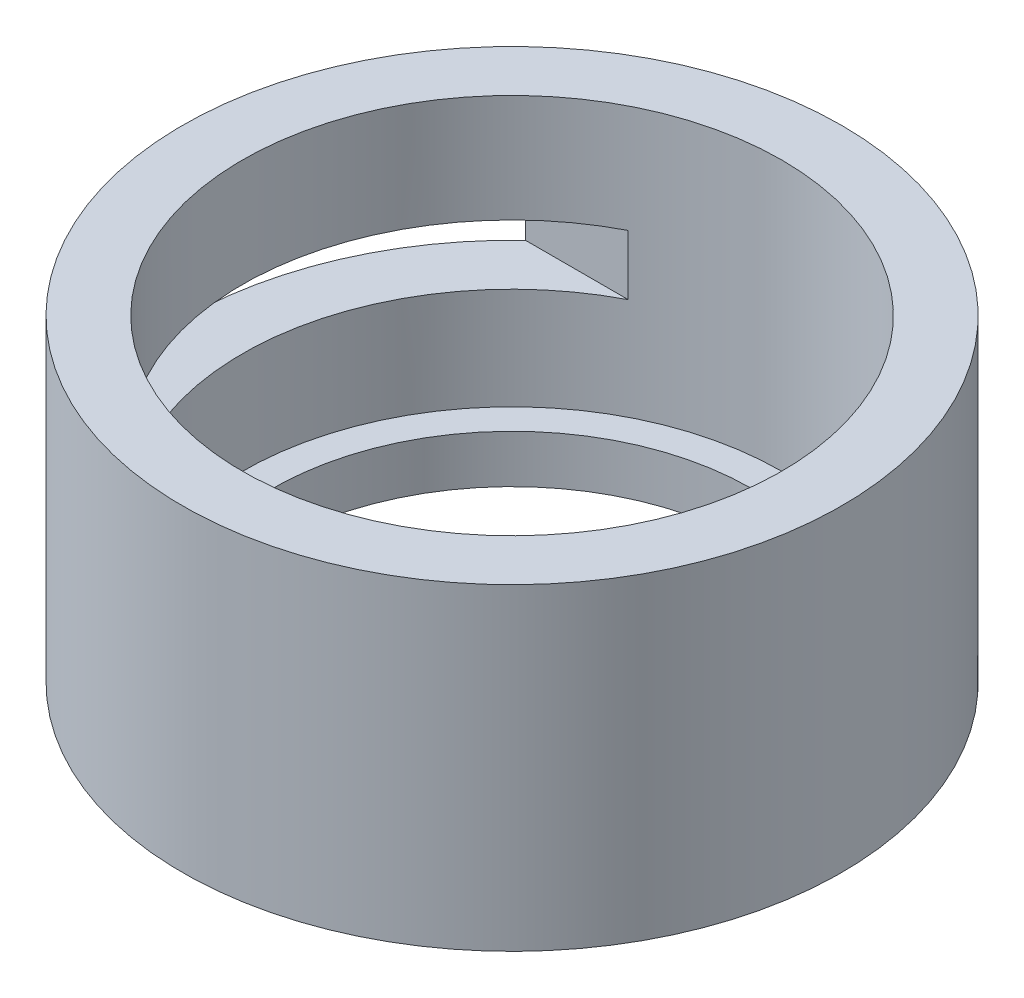
ISO-10303-21;
HEADER;
FILE_DESCRIPTION(('STEP AP214'),'2;1');
FILE_NAME('part.step','',(''),(''),'','','');
FILE_SCHEMA(('AUTOMOTIVE_DESIGN { 1 0 10303 214 1 1 1 1 }'));
ENDSEC;
DATA;
#1=APPLICATION_CONTEXT('core data for automotive mechanical design processes');
#2=APPLICATION_PROTOCOL_DEFINITION('international standard','automotive_design',2000,#1);
#3=PRODUCT_CONTEXT('',#1,'mechanical');
#4=PRODUCT('Part','Part','',(#3));
#5=PRODUCT_RELATED_PRODUCT_CATEGORY('part','',(#4));
#6=PRODUCT_DEFINITION_FORMATION('','',#4);
#7=PRODUCT_DEFINITION_CONTEXT('part definition',#1,'design');
#8=PRODUCT_DEFINITION('design','',#6,#7);
#9=PRODUCT_DEFINITION_SHAPE('','',#8);
#10=(LENGTH_UNIT() NAMED_UNIT(*) SI_UNIT(.MILLI.,.METRE.));
#11=(NAMED_UNIT(*) PLANE_ANGLE_UNIT() SI_UNIT($,.RADIAN.));
#12=(NAMED_UNIT(*) SI_UNIT($,.STERADIAN.) SOLID_ANGLE_UNIT());
#13=UNCERTAINTY_MEASURE_WITH_UNIT(LENGTH_MEASURE(1.E-05),#10,'distance_accuracy_value','');
#14=(GEOMETRIC_REPRESENTATION_CONTEXT(3) GLOBAL_UNCERTAINTY_ASSIGNED_CONTEXT((#13)) GLOBAL_UNIT_ASSIGNED_CONTEXT((#10,
#11,#12)) REPRESENTATION_CONTEXT('',''));
#15=CARTESIAN_POINT('',(0.,0.,0.));
#16=DIRECTION('',(0.,0.,1.));
#17=DIRECTION('',(1.,0.,0.));
#18=AXIS2_PLACEMENT_3D('',#15,#16,#17);
#19=CARTESIAN_POINT('',(0.,0.,0.));
#20=DIRECTION('',(0.,-1.,0.));
#21=DIRECTION('',(0.,0.,-1.));
#22=AXIS2_PLACEMENT_3D('',#19,#20,#21);
#23=CYLINDRICAL_SURFACE('',#22,40.);
#24=CARTESIAN_POINT('',(0.,7.91521559908043,0.));
#25=DIRECTION('',(0.,-1.,0.));
#26=DIRECTION('',(0.,0.,-1.));
#27=AXIS2_PLACEMENT_3D('',#24,#25,#26);
#28=CIRCLE('',#27,40.);
#29=CARTESIAN_POINT('',(0.,7.91521559908043,-40.));
#30=VERTEX_POINT('',#29);
#31=EDGE_CURVE('E82',#30,#30,#28,.T.);
#32=ORIENTED_EDGE('',*,*,#31,.T.);
#33=EDGE_LOOP('',(#32));
#34=FACE_BOUND('',#33,.T.);
#35=CARTESIAN_POINT('',(0.,15.9152155990804,0.));
#36=DIRECTION('',(0.,-1.,0.));
#37=DIRECTION('',(0.,0.,-1.));
#38=AXIS2_PLACEMENT_3D('',#35,#36,#37);
#39=CIRCLE('',#38,40.);
#40=CARTESIAN_POINT('',(0.,15.9152155990804,-40.));
#41=VERTEX_POINT('',#40);
#42=EDGE_CURVE('E109',#41,#41,#39,.T.);
#43=ORIENTED_EDGE('',*,*,#42,.F.);
#44=EDGE_LOOP('',(#43));
#45=FACE_BOUND('',#44,.T.);
#46=ADVANCED_FACE('F33',(#34,#45),#23,.F.);
#47=CARTESIAN_POINT('',(40.,7.91521559908043,0.));
#48=DIRECTION('',(0.,-1.,0.));
#49=DIRECTION('',(0.,0.,-1.));
#50=AXIS2_PLACEMENT_3D('',#47,#48,#49);
#51=PLANE('',#50);
#52=CARTESIAN_POINT('',(0.,7.91521559908043,0.));
#53=DIRECTION('',(0.,-1.,0.));
#54=DIRECTION('',(0.,0.,-1.));
#55=AXIS2_PLACEMENT_3D('',#52,#53,#54);
#56=CIRCLE('',#55,55.);
#57=CARTESIAN_POINT('',(0.,7.91521559908043,-55.));
#58=VERTEX_POINT('',#57);
#59=EDGE_CURVE('E97',#58,#58,#56,.T.);
#60=ORIENTED_EDGE('',*,*,#59,.T.);
#61=EDGE_LOOP('',(#60));
#62=FACE_BOUND('',#61,.T.);
#63=ORIENTED_EDGE('',*,*,#31,.F.);
#64=EDGE_LOOP('',(#63));
#65=FACE_BOUND('',#64,.T.);
#66=ADVANCED_FACE('F139',(#62,#65),#51,.T.);
#67=CARTESIAN_POINT('',(0.,0.,0.));
#68=DIRECTION('',(0.,-1.,0.));
#69=DIRECTION('',(0.,0.,-1.));
#70=AXIS2_PLACEMENT_3D('',#67,#68,#69);
#71=CYLINDRICAL_SURFACE('',#70,55.);
#72=CARTESIAN_POINT('',(0.,32.9152155990804,0.));
#73=DIRECTION('',(0.,-1.,0.));
#74=DIRECTION('',(0.,0.,-1.));
#75=AXIS2_PLACEMENT_3D('',#72,#73,#74);
#76=CIRCLE('',#75,55.);
#77=CARTESIAN_POINT('',(-37.7491721763537,32.9152155990804,-40.));
#78=VERTEX_POINT('',#77);
#79=CARTESIAN_POINT('',(-37.7491721763537,32.9152155990804,40.));
#80=VERTEX_POINT('',#79);
#81=EDGE_CURVE('E116',#78,#80,#76,.F.);
#82=ORIENTED_EDGE('',*,*,#81,.F.);
#83=DIRECTION('',(0.,-1.,0.));
#84=VECTOR('',#83,1.);
#85=CARTESIAN_POINT('',(-37.7491721763537,0.,-40.));
#86=LINE('',#85,#84);
#87=CARTESIAN_POINT('',(-37.7491721763537,42.9152155990804,-40.));
#88=VERTEX_POINT('',#87);
#89=EDGE_CURVE('E87',#88,#78,#86,.T.);
#90=ORIENTED_EDGE('',*,*,#89,.F.);
#91=CARTESIAN_POINT('',(0.,42.9152155990804,0.));
#92=DIRECTION('',(0.,1.,0.));
#93=DIRECTION('',(0.,0.,1.));
#94=AXIS2_PLACEMENT_3D('',#91,#92,#93);
#95=CIRCLE('',#94,55.);
#96=CARTESIAN_POINT('',(-37.7491721763537,42.9152155990804,40.));
#97=VERTEX_POINT('',#96);
#98=EDGE_CURVE('E55',#97,#88,#95,.F.);
#99=ORIENTED_EDGE('',*,*,#98,.F.);
#100=DIRECTION('',(0.,-1.,0.));
#101=VECTOR('',#100,1.);
#102=CARTESIAN_POINT('',(-37.7491721763537,0.,40.));
#103=LINE('',#102,#101);
#104=EDGE_CURVE('E114',#80,#97,#103,.F.);
#105=ORIENTED_EDGE('',*,*,#104,.F.);
#106=EDGE_LOOP('',(#82,#90,#99,#105));
#107=FACE_BOUND('',#106,.T.);
#108=CARTESIAN_POINT('',(0.,60.9152155990804,0.));
#109=DIRECTION('',(0.,-1.,0.));
#110=DIRECTION('',(0.,0.,-1.));
#111=AXIS2_PLACEMENT_3D('',#108,#109,#110);
#112=CIRCLE('',#111,55.);
#113=CARTESIAN_POINT('',(0.,60.9152155990804,-55.));
#114=VERTEX_POINT('',#113);
#115=EDGE_CURVE('E100',#114,#114,#112,.T.);
#116=ORIENTED_EDGE('',*,*,#115,.T.);
#117=EDGE_LOOP('',(#116));
#118=FACE_BOUND('',#117,.T.);
#119=ORIENTED_EDGE('',*,*,#59,.F.);
#120=EDGE_LOOP('',(#119));
#121=FACE_BOUND('',#120,.T.);
#122=ADVANCED_FACE('F123',(#107,#118,#121),#71,.T.);
#123=CARTESIAN_POINT('',(55.,60.9152155990804,0.));
#124=DIRECTION('',(0.,1.,0.));
#125=DIRECTION('',(0.,0.,1.));
#126=AXIS2_PLACEMENT_3D('',#123,#124,#125);
#127=PLANE('',#126);
#128=CARTESIAN_POINT('',(0.,60.9152155990804,0.));
#129=DIRECTION('',(0.,-1.,0.));
#130=DIRECTION('',(0.,0.,-1.));
#131=AXIS2_PLACEMENT_3D('',#128,#129,#130);
#132=CIRCLE('',#131,45.);
#133=CARTESIAN_POINT('',(0.,60.9152155990804,-45.));
#134=VERTEX_POINT('',#133);
#135=EDGE_CURVE('E103',#134,#134,#132,.T.);
#136=ORIENTED_EDGE('',*,*,#135,.T.);
#137=EDGE_LOOP('',(#136));
#138=FACE_BOUND('',#137,.T.);
#139=ORIENTED_EDGE('',*,*,#115,.F.);
#140=EDGE_LOOP('',(#139));
#141=FACE_BOUND('',#140,.T.);
#142=ADVANCED_FACE('F155',(#138,#141),#127,.T.);
#143=CARTESIAN_POINT('',(0.,0.,0.));
#144=DIRECTION('',(0.,-1.,0.));
#145=DIRECTION('',(0.,0.,-1.));
#146=AXIS2_PLACEMENT_3D('',#143,#144,#145);
#147=CYLINDRICAL_SURFACE('',#146,45.);
#148=DIRECTION('',(0.,-1.,0.));
#149=VECTOR('',#148,1.);
#150=CARTESIAN_POINT('',(-20.6155281280883,0.,-40.));
#151=LINE('',#150,#149);
#152=CARTESIAN_POINT('',(-20.6155281280883,32.9152155990804,-40.));
#153=VERTEX_POINT('',#152);
#154=CARTESIAN_POINT('',(-20.6155281280883,42.9152155990804,-40.));
#155=VERTEX_POINT('',#154);
#156=EDGE_CURVE('E11',#153,#155,#151,.F.);
#157=ORIENTED_EDGE('',*,*,#156,.F.);
#158=CARTESIAN_POINT('',(0.,32.9152155990804,0.));
#159=DIRECTION('',(0.,-1.,0.));
#160=DIRECTION('',(0.,0.,-1.));
#161=AXIS2_PLACEMENT_3D('',#158,#159,#160);
#162=CIRCLE('',#161,45.);
#163=CARTESIAN_POINT('',(-20.6155281280883,32.9152155990804,40.));
#164=VERTEX_POINT('',#163);
#165=EDGE_CURVE('E73',#164,#153,#162,.T.);
#166=ORIENTED_EDGE('',*,*,#165,.F.);
#167=DIRECTION('',(0.,-1.,0.));
#168=VECTOR('',#167,1.);
#169=CARTESIAN_POINT('',(-20.6155281280883,0.,40.));
#170=LINE('',#169,#168);
#171=CARTESIAN_POINT('',(-20.6155281280883,42.9152155990804,40.));
#172=VERTEX_POINT('',#171);
#173=EDGE_CURVE('E81',#172,#164,#170,.T.);
#174=ORIENTED_EDGE('',*,*,#173,.F.);
#175=CARTESIAN_POINT('',(0.,42.9152155990804,0.));
#176=DIRECTION('',(0.,1.,0.));
#177=DIRECTION('',(0.,0.,1.));
#178=AXIS2_PLACEMENT_3D('',#175,#176,#177);
#179=CIRCLE('',#178,45.);
#180=EDGE_CURVE('E40',#155,#172,#179,.T.);
#181=ORIENTED_EDGE('',*,*,#180,.F.);
#182=EDGE_LOOP('',(#157,#166,#174,#181));
#183=FACE_BOUND('',#182,.T.);
#184=CARTESIAN_POINT('',(0.,15.9152155990804,0.));
#185=DIRECTION('',(0.,-1.,0.));
#186=DIRECTION('',(0.,0.,-1.));
#187=AXIS2_PLACEMENT_3D('',#184,#185,#186);
#188=CIRCLE('',#187,45.);
#189=CARTESIAN_POINT('',(0.,15.9152155990804,-45.));
#190=VERTEX_POINT('',#189);
#191=EDGE_CURVE('E106',#190,#190,#188,.T.);
#192=ORIENTED_EDGE('',*,*,#191,.T.);
#193=EDGE_LOOP('',(#192));
#194=FACE_BOUND('',#193,.T.);
#195=ORIENTED_EDGE('',*,*,#135,.F.);
#196=EDGE_LOOP('',(#195));
#197=FACE_BOUND('',#196,.T.);
#198=ADVANCED_FACE('F90',(#183,#194,#197),#147,.F.);
#199=CARTESIAN_POINT('',(45.,15.9152155990804,0.));
#200=DIRECTION('',(0.,1.,0.));
#201=DIRECTION('',(0.,0.,1.));
#202=AXIS2_PLACEMENT_3D('',#199,#200,#201);
#203=PLANE('',#202);
#204=ORIENTED_EDGE('',*,*,#42,.T.);
#205=EDGE_LOOP('',(#204));
#206=FACE_BOUND('',#205,.T.);
#207=ORIENTED_EDGE('',*,*,#191,.F.);
#208=EDGE_LOOP('',(#207));
#209=FACE_BOUND('',#208,.T.);
#210=ADVANCED_FACE('F136',(#206,#209),#203,.T.);
#211=CARTESIAN_POINT('',(-16.,42.9152155990804,-40.));
#212=DIRECTION('',(0.,0.,-1.));
#213=DIRECTION('',(-1.,0.,0.));
#214=AXIS2_PLACEMENT_3D('',#211,#212,#213);
#215=PLANE('',#214);
#216=ORIENTED_EDGE('',*,*,#89,.T.);
#217=DIRECTION('',(-1.,0.,0.));
#218=VECTOR('',#217,1.);
#219=CARTESIAN_POINT('',(-16.,32.9152155990804,-40.));
#220=LINE('',#219,#218);
#221=EDGE_CURVE('E76',#153,#78,#220,.T.);
#222=ORIENTED_EDGE('',*,*,#221,.F.);
#223=ORIENTED_EDGE('',*,*,#156,.T.);
#224=DIRECTION('',(-1.,0.,0.));
#225=VECTOR('',#224,1.);
#226=CARTESIAN_POINT('',(-16.,42.9152155990804,-40.));
#227=LINE('',#226,#225);
#228=EDGE_CURVE('E117',#155,#88,#227,.T.);
#229=ORIENTED_EDGE('',*,*,#228,.T.);
#230=EDGE_LOOP('',(#216,#222,#223,#229));
#231=FACE_BOUND('',#230,.T.);
#232=ADVANCED_FACE('F85',(#231),#215,.F.);
#233=CARTESIAN_POINT('',(-16.,42.9152155990804,-40.));
#234=DIRECTION('',(0.,1.,0.));
#235=DIRECTION('',(0.,0.,1.));
#236=AXIS2_PLACEMENT_3D('',#233,#234,#235);
#237=PLANE('',#236);
#238=ORIENTED_EDGE('',*,*,#98,.T.);
#239=ORIENTED_EDGE('',*,*,#228,.F.);
#240=ORIENTED_EDGE('',*,*,#180,.T.);
#241=DIRECTION('',(-1.,0.,0.));
#242=VECTOR('',#241,1.);
#243=CARTESIAN_POINT('',(-16.,42.9152155990804,40.));
#244=LINE('',#243,#242);
#245=EDGE_CURVE('E120',#172,#97,#244,.T.);
#246=ORIENTED_EDGE('',*,*,#245,.T.);
#247=EDGE_LOOP('',(#238,#239,#240,#246));
#248=FACE_BOUND('',#247,.T.);
#249=ADVANCED_FACE('F128',(#248),#237,.F.);
#250=CARTESIAN_POINT('',(-16.,42.9152155990804,40.));
#251=DIRECTION('',(0.,0.,1.));
#252=DIRECTION('',(1.,0.,0.));
#253=AXIS2_PLACEMENT_3D('',#250,#251,#252);
#254=PLANE('',#253);
#255=ORIENTED_EDGE('',*,*,#104,.T.);
#256=ORIENTED_EDGE('',*,*,#245,.F.);
#257=ORIENTED_EDGE('',*,*,#173,.T.);
#258=DIRECTION('',(-1.,0.,0.));
#259=VECTOR('',#258,1.);
#260=CARTESIAN_POINT('',(-16.,32.9152155990804,40.));
#261=LINE('',#260,#259);
#262=EDGE_CURVE('E47',#164,#80,#261,.T.);
#263=ORIENTED_EDGE('',*,*,#262,.T.);
#264=EDGE_LOOP('',(#255,#256,#257,#263));
#265=FACE_BOUND('',#264,.T.);
#266=ADVANCED_FACE('F127',(#265),#254,.F.);
#267=CARTESIAN_POINT('',(-16.,32.9152155990804,-40.));
#268=DIRECTION('',(0.,-1.,0.));
#269=DIRECTION('',(0.,0.,-1.));
#270=AXIS2_PLACEMENT_3D('',#267,#268,#269);
#271=PLANE('',#270);
#272=ORIENTED_EDGE('',*,*,#81,.T.);
#273=ORIENTED_EDGE('',*,*,#262,.F.);
#274=ORIENTED_EDGE('',*,*,#165,.T.);
#275=ORIENTED_EDGE('',*,*,#221,.T.);
#276=EDGE_LOOP('',(#272,#273,#274,#275));
#277=FACE_BOUND('',#276,.T.);
#278=ADVANCED_FACE('F75',(#277),#271,.F.);
#279=CLOSED_SHELL('',(#46,#66,#122,#142,#198,#210,#232,#249,#266,#278));
#280=MANIFOLD_SOLID_BREP('B2',#279);
#281=ADVANCED_BREP_SHAPE_REPRESENTATION('',(#18,#280),#14);
#282=SHAPE_DEFINITION_REPRESENTATION(#9,#281);
ENDSEC;
END-ISO-10303-21;
